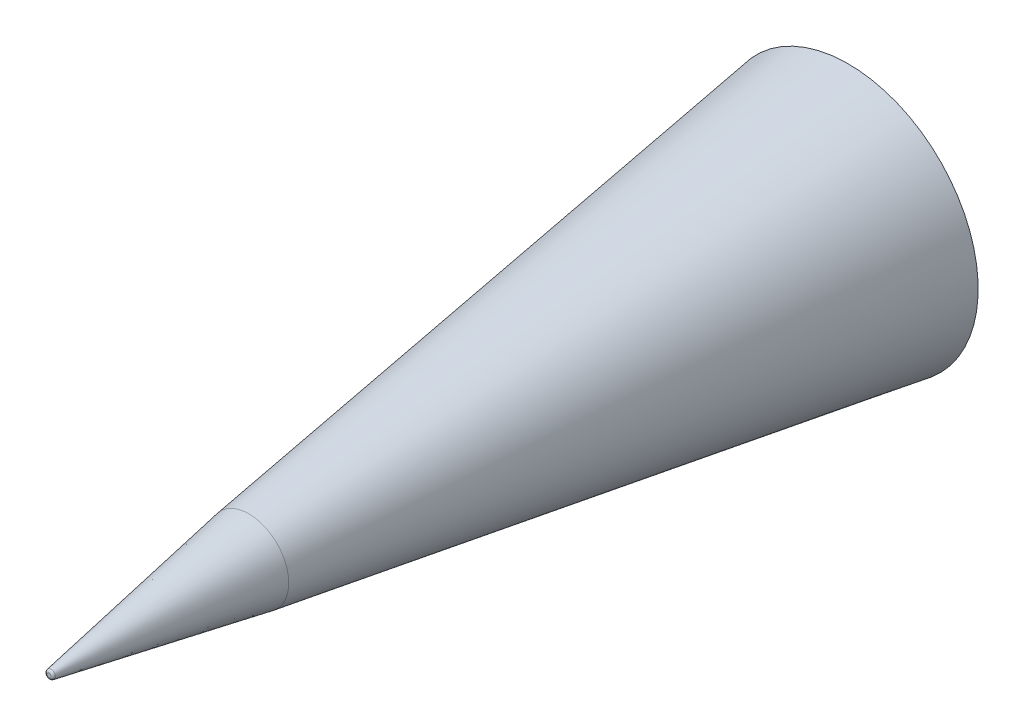
ISO-10303-21;
HEADER;
FILE_DESCRIPTION(('STEP AP214'),'2;1');
FILE_NAME('part.step','',(''),(''),'','','');
FILE_SCHEMA(('AUTOMOTIVE_DESIGN { 1 0 10303 214 1 1 1 1 }'));
ENDSEC;
DATA;
#1=APPLICATION_CONTEXT('core data for automotive mechanical design processes');
#2=APPLICATION_PROTOCOL_DEFINITION('international standard','automotive_design',2000,#1);
#3=PRODUCT_CONTEXT('',#1,'mechanical');
#4=PRODUCT('Part','Part','',(#3));
#5=PRODUCT_RELATED_PRODUCT_CATEGORY('part','',(#4));
#6=PRODUCT_DEFINITION_FORMATION('','',#4);
#7=PRODUCT_DEFINITION_CONTEXT('part definition',#1,'design');
#8=PRODUCT_DEFINITION('design','',#6,#7);
#9=PRODUCT_DEFINITION_SHAPE('','',#8);
#10=(LENGTH_UNIT() NAMED_UNIT(*) SI_UNIT(.MILLI.,.METRE.));
#11=(NAMED_UNIT(*) PLANE_ANGLE_UNIT() SI_UNIT($,.RADIAN.));
#12=(NAMED_UNIT(*) SI_UNIT($,.STERADIAN.) SOLID_ANGLE_UNIT());
#13=UNCERTAINTY_MEASURE_WITH_UNIT(LENGTH_MEASURE(1.E-05),#10,'distance_accuracy_value','');
#14=(GEOMETRIC_REPRESENTATION_CONTEXT(3) GLOBAL_UNCERTAINTY_ASSIGNED_CONTEXT((#13)) GLOBAL_UNIT_ASSIGNED_CONTEXT((#10,
#11,#12)) REPRESENTATION_CONTEXT('',''));
#15=CARTESIAN_POINT('',(0.,0.,0.));
#16=DIRECTION('',(0.,0.,1.));
#17=DIRECTION('',(1.,0.,0.));
#18=AXIS2_PLACEMENT_3D('',#15,#16,#17);
#19=CARTESIAN_POINT('',(0.,3.25,-20.));
#20=DIRECTION('',(0.,0.,1.));
#21=DIRECTION('',(1.,0.,0.));
#22=AXIS2_PLACEMENT_3D('',#19,#20,#21);
#23=PLANE('',#22);
#24=CARTESIAN_POINT('',(0.,0.,-20.));
#25=DIRECTION('',(0.,0.,1.));
#26=DIRECTION('',(1.,0.,0.));
#27=AXIS2_PLACEMENT_3D('',#24,#25,#26);
#28=CIRCLE('',#27,3.25);
#29=CARTESIAN_POINT('',(-3.25,0.,-20.));
#30=VERTEX_POINT('',#29);
#31=EDGE_CURVE('E44',#30,#30,#28,.T.);
#32=ORIENTED_EDGE('',*,*,#31,.F.);
#33=EDGE_LOOP('',(#32));
#34=FACE_BOUND('',#33,.T.);
#35=ADVANCED_FACE('F33',(#34),#23,.F.);
#36=CARTESIAN_POINT('',(0.,0.,-20.));
#37=DIRECTION('',(0.,0.,-1.));
#38=DIRECTION('',(-1.,0.,0.));
#39=AXIS2_PLACEMENT_3D('',#36,#37,#38);
#40=CONICAL_SURFACE('',#39,3.25,0.148889947609497);
#41=CARTESIAN_POINT('',(0.,0.,-5.));
#42=DIRECTION('',(0.,0.,1.));
#43=DIRECTION('',(1.,0.,0.));
#44=AXIS2_PLACEMENT_3D('',#41,#42,#43);
#45=CIRCLE('',#44,0.999999999999998);
#46=CARTESIAN_POINT('',(-0.999999999999998,0.,-5.));
#47=VERTEX_POINT('',#46);
#48=EDGE_CURVE('E48',#47,#47,#45,.T.);
#49=CARTESIAN_POINT('',(-0.999999999999998,0.,-5.));
#50=CARTESIAN_POINT('',(-1.0234375,0.,-5.15625));
#51=CARTESIAN_POINT('',(-1.046875,0.,-5.3125));
#52=CARTESIAN_POINT('',(-1.09375,0.,-5.62500000000001));
#53=CARTESIAN_POINT('',(-1.1171875,0.,-5.78125000000001));
#54=CARTESIAN_POINT('',(-1.1640625,0.,-6.09375));
#55=CARTESIAN_POINT('',(-1.1875,0.,-6.25));
#56=CARTESIAN_POINT('',(-1.234375,0.,-6.5625));
#57=CARTESIAN_POINT('',(-1.2578125,0.,-6.71875));
#58=CARTESIAN_POINT('',(-1.3046875,0.,-7.03125));
#59=CARTESIAN_POINT('',(-1.328125,0.,-7.1875));
#60=CARTESIAN_POINT('',(-1.375,0.,-7.50000000000001));
#61=CARTESIAN_POINT('',(-1.3984375,0.,-7.65625000000001));
#62=CARTESIAN_POINT('',(-1.4453125,0.,-7.96875000000001));
#63=CARTESIAN_POINT('',(-1.46875,0.,-8.125));
#64=CARTESIAN_POINT('',(-1.515625,0.,-8.4375));
#65=CARTESIAN_POINT('',(-1.5390625,0.,-8.59375));
#66=CARTESIAN_POINT('',(-1.5859375,0.,-8.90625));
#67=CARTESIAN_POINT('',(-1.609375,0.,-9.06250000000001));
#68=CARTESIAN_POINT('',(-1.65625,0.,-9.37500000000001));
#69=CARTESIAN_POINT('',(-1.6796875,0.,-9.53125000000001));
#70=CARTESIAN_POINT('',(-1.7265625,0.,-9.84375000000001));
#71=CARTESIAN_POINT('',(-1.75,0.,-10.));
#72=CARTESIAN_POINT('',(-1.796875,0.,-10.3125));
#73=CARTESIAN_POINT('',(-1.8203125,0.,-10.46875));
#74=CARTESIAN_POINT('',(-1.8671875,0.,-10.78125));
#75=CARTESIAN_POINT('',(-1.890625,0.,-10.9375));
#76=CARTESIAN_POINT('',(-1.9375,0.,-11.25));
#77=CARTESIAN_POINT('',(-1.9609375,0.,-11.40625));
#78=CARTESIAN_POINT('',(-2.0078125,0.,-11.71875));
#79=CARTESIAN_POINT('',(-2.03125,0.,-11.875));
#80=CARTESIAN_POINT('',(-2.078125,0.,-12.1875));
#81=CARTESIAN_POINT('',(-2.1015625,0.,-12.34375));
#82=CARTESIAN_POINT('',(-2.1484375,0.,-12.65625));
#83=CARTESIAN_POINT('',(-2.171875,0.,-12.8125));
#84=CARTESIAN_POINT('',(-2.21875,0.,-13.125));
#85=CARTESIAN_POINT('',(-2.2421875,0.,-13.28125));
#86=CARTESIAN_POINT('',(-2.2890625,0.,-13.59375));
#87=CARTESIAN_POINT('',(-2.3125,0.,-13.75));
#88=CARTESIAN_POINT('',(-2.359375,0.,-14.0625));
#89=CARTESIAN_POINT('',(-2.3828125,0.,-14.21875));
#90=CARTESIAN_POINT('',(-2.4296875,0.,-14.53125));
#91=CARTESIAN_POINT('',(-2.453125,0.,-14.6875));
#92=CARTESIAN_POINT('',(-2.5,0.,-15.));
#93=CARTESIAN_POINT('',(-2.5234375,0.,-15.15625));
#94=CARTESIAN_POINT('',(-2.5703125,0.,-15.46875));
#95=CARTESIAN_POINT('',(-2.59375,0.,-15.625));
#96=CARTESIAN_POINT('',(-2.640625,0.,-15.9375));
#97=CARTESIAN_POINT('',(-2.6640625,0.,-16.09375));
#98=CARTESIAN_POINT('',(-2.7109375,0.,-16.40625));
#99=CARTESIAN_POINT('',(-2.734375,0.,-16.5625));
#100=CARTESIAN_POINT('',(-2.78125,0.,-16.875));
#101=CARTESIAN_POINT('',(-2.8046875,0.,-17.03125));
#102=CARTESIAN_POINT('',(-2.8515625,0.,-17.34375));
#103=CARTESIAN_POINT('',(-2.875,0.,-17.5));
#104=CARTESIAN_POINT('',(-2.921875,0.,-17.8125));
#105=CARTESIAN_POINT('',(-2.9453125,0.,-17.96875));
#106=CARTESIAN_POINT('',(-2.9921875,0.,-18.28125));
#107=CARTESIAN_POINT('',(-3.015625,0.,-18.4375));
#108=CARTESIAN_POINT('',(-3.0625,0.,-18.75));
#109=CARTESIAN_POINT('',(-3.0859375,0.,-18.90625));
#110=CARTESIAN_POINT('',(-3.1328125,0.,-19.21875));
#111=CARTESIAN_POINT('',(-3.15625,0.,-19.375));
#112=CARTESIAN_POINT('',(-3.203125,0.,-19.6875));
#113=CARTESIAN_POINT('',(-3.2265625,0.,-19.84375));
#114=CARTESIAN_POINT('',(-3.25,0.,-20.));
#115=B_SPLINE_CURVE_WITH_KNOTS('',3,(#49,#50,#51,#52,#53,#54,#55,#56,#57,#58,#59,#60,#61,#62,
#63,#64,#65,#66,#67,#68,#69,#70,#71,#72,#73,#74,#75,#76,#77,#78,#79,#80,#81,#82,#83,#84,#85,#86,
#87,#88,#89,#90,#91,#92,#93,#94,#95,#96,#97,#98,#99,#100,#101,#102,#103,#104,#105,#106,#107,
#108,#109,#110,#111,#112,#113,#114),.UNSPECIFIED.,.F.,.F.,(4,2,2,2,2,2,2,2,2,2,2,2,2,2,2,2,2,2,
2,2,2,2,2,2,2,2,2,2,2,2,2,2,4),(0.,0.473994103503673,0.947988207007346,1.42198231051102,
1.89597641401469,2.36997051751836,2.84396462102203,3.31795872452571,3.79195282802938,
4.26594693153305,4.73994103503672,5.2139351385404,5.68792924204407,6.16192334554774,
6.63591744905141,7.10991155255508,7.58390565605876,8.05789975956243,8.5318938630661,
9.00588796656978,9.47988207007345,9.95387617357712,10.4278702770808,10.9018643805845,
11.3758584840881,11.8498525875918,12.3238466910955,12.7978407945992,13.2718348981028,
13.7458290016065,14.2198231051102,14.6938172086138,15.1678113121175),.UNSPECIFIED.);
#116=EDGE_CURVE('BSEAM56',#47,#30,#115,.T.);
#117=ORIENTED_EDGE('',*,*,#48,.F.);
#118=ORIENTED_EDGE('',*,*,#31,.T.);
#119=ORIENTED_EDGE('',*,*,#116,.T.);
#120=ORIENTED_EDGE('',*,*,#116,.F.);
#121=EDGE_LOOP('',(#117,#119,#118,#120));
#122=FACE_BOUND('',#121,.T.);
#123=ADVANCED_FACE('F56',(#122),#40,.T.);
#124=CARTESIAN_POINT('',(0.,0.,-5.));
#125=DIRECTION('',(0.,0.,-1.));
#126=DIRECTION('',(-1.,0.,0.));
#127=AXIS2_PLACEMENT_3D('',#124,#125,#126);
#128=CONICAL_SURFACE('',#127,0.999999999999998,0.178092938231197);
#129=CARTESIAN_POINT('',(0.,0.,-0.0493708201010842));
#130=DIRECTION('',(0.,0.,1.));
#131=DIRECTION('',(1.,0.,0.));
#132=AXIS2_PLACEMENT_3D('',#129,#130,#131);
#133=CIRCLE('',#132,0.108886747618195);
#134=CARTESIAN_POINT('',(-0.108886747618195,0.,-0.0493708201010842));
#135=VERTEX_POINT('',#134);
#136=EDGE_CURVE('E10',#135,#135,#133,.F.);
#137=CARTESIAN_POINT('',(-0.108886747618195,0.,-0.0493708201010842));
#138=CARTESIAN_POINT('',(-0.118169177330506,0.,-0.100939874058365));
#139=CARTESIAN_POINT('',(-0.127451607042816,0.,-0.152508928015645));
#140=CARTESIAN_POINT('',(-0.146016466467437,0.,-0.255647035930206));
#141=CARTESIAN_POINT('',(-0.155298896179747,0.,-0.307216089887487));
#142=CARTESIAN_POINT('',(-0.173863755604368,0.,-0.410354197802048));
#143=CARTESIAN_POINT('',(-0.183146185316679,0.,-0.461923251759328));
#144=CARTESIAN_POINT('',(-0.2017110447413,0.,-0.565061359673889));
#145=CARTESIAN_POINT('',(-0.21099347445361,0.,-0.616630413631169));
#146=CARTESIAN_POINT('',(-0.229558333878231,0.,-0.71976852154573));
#147=CARTESIAN_POINT('',(-0.238840763590541,0.,-0.77133757550301));
#148=CARTESIAN_POINT('',(-0.257405623015162,0.,-0.874475683417571));
#149=CARTESIAN_POINT('',(-0.266688052727473,0.,-0.926044737374852));
#150=CARTESIAN_POINT('',(-0.285252912152094,0.,-1.02918284528941));
#151=CARTESIAN_POINT('',(-0.294535341864404,0.,-1.08075189924669));
#152=CARTESIAN_POINT('',(-0.313100201289025,0.,-1.18389000716125));
#153=CARTESIAN_POINT('',(-0.322382631001335,0.,-1.23545906111853));
#154=CARTESIAN_POINT('',(-0.340947490425956,0.,-1.33859716903309));
#155=CARTESIAN_POINT('',(-0.350229920138267,0.,-1.39016622299038));
#156=CARTESIAN_POINT('',(-0.368794779562888,0.,-1.49330433090494));
#157=CARTESIAN_POINT('',(-0.378077209275198,0.,-1.54487338486222));
#158=CARTESIAN_POINT('',(-0.396642068699819,0.,-1.64801149277678));
#159=CARTESIAN_POINT('',(-0.40592449841213,0.,-1.69958054673406));
#160=CARTESIAN_POINT('',(-0.42448935783675,0.,-1.80271865464862));
#161=CARTESIAN_POINT('',(-0.433771787549061,0.,-1.8542877086059));
#162=CARTESIAN_POINT('',(-0.452336646973682,0.,-1.95742581652046));
#163=CARTESIAN_POINT('',(-0.461619076685992,0.,-2.00899487047774));
#164=CARTESIAN_POINT('',(-0.480183936110613,0.,-2.1121329783923));
#165=CARTESIAN_POINT('',(-0.489466365822924,0.,-2.16370203234958));
#166=CARTESIAN_POINT('',(-0.508031225247544,0.,-2.26684014026414));
#167=CARTESIAN_POINT('',(-0.517313654959855,0.,-2.31840919422142));
#168=CARTESIAN_POINT('',(-0.535878514384476,0.,-2.42154730213598));
#169=CARTESIAN_POINT('',(-0.545160944096786,0.,-2.47311635609326));
#170=CARTESIAN_POINT('',(-0.563725803521407,0.,-2.57625446400783));
#171=CARTESIAN_POINT('',(-0.573008233233718,0.,-2.62782351796511));
#172=CARTESIAN_POINT('',(-0.591573092658338,0.,-2.73096162587967));
#173=CARTESIAN_POINT('',(-0.600855522370649,0.,-2.78253067983695));
#174=CARTESIAN_POINT('',(-0.61942038179527,0.,-2.88566878775151));
#175=CARTESIAN_POINT('',(-0.62870281150758,0.,-2.93723784170879));
#176=CARTESIAN_POINT('',(-0.647267670932201,0.,-3.04037594962335));
#177=CARTESIAN_POINT('',(-0.656550100644512,0.,-3.09194500358063));
#178=CARTESIAN_POINT('',(-0.675114960069133,0.,-3.19508311149519));
#179=CARTESIAN_POINT('',(-0.684397389781443,0.,-3.24665216545247));
#180=CARTESIAN_POINT('',(-0.702962249206064,0.,-3.34979027336703));
#181=CARTESIAN_POINT('',(-0.712244678918374,0.,-3.40135932732431));
#182=CARTESIAN_POINT('',(-0.730809538342995,0.,-3.50449743523887));
#183=CARTESIAN_POINT('',(-0.740091968055306,0.,-3.55606648919615));
#184=CARTESIAN_POINT('',(-0.758656827479926,0.,-3.65920459711071));
#185=CARTESIAN_POINT('',(-0.767939257192237,0.,-3.71077365106799));
#186=CARTESIAN_POINT('',(-0.786504116616858,0.,-3.81391175898256));
#187=CARTESIAN_POINT('',(-0.795786546329168,0.,-3.86548081293984));
#188=CARTESIAN_POINT('',(-0.814351405753789,0.,-3.9686189208544));
#189=CARTESIAN_POINT('',(-0.8236338354661,0.,-4.02018797481168));
#190=CARTESIAN_POINT('',(-0.842198694890721,0.,-4.12332608272624));
#191=CARTESIAN_POINT('',(-0.851481124603031,0.,-4.17489513668352));
#192=CARTESIAN_POINT('',(-0.870045984027652,0.,-4.27803324459808));
#193=CARTESIAN_POINT('',(-0.879328413739962,0.,-4.32960229855536));
#194=CARTESIAN_POINT('',(-0.897893273164583,0.,-4.43274040646992));
#195=CARTESIAN_POINT('',(-0.907175702876894,0.,-4.4843094604272));
#196=CARTESIAN_POINT('',(-0.925740562301515,0.,-4.58744756834176));
#197=CARTESIAN_POINT('',(-0.935022992013825,0.,-4.63901662229904));
#198=CARTESIAN_POINT('',(-0.953587851438446,0.,-4.7421547302136));
#199=CARTESIAN_POINT('',(-0.962870281150756,0.,-4.79372378417088));
#200=CARTESIAN_POINT('',(-0.981435140575377,0.,-4.89686189208544));
#201=CARTESIAN_POINT('',(-0.990717570287688,0.,-4.94843094604273));
#202=CARTESIAN_POINT('',(-0.999999999999998,0.,-5.00000000000001));
#203=B_SPLINE_CURVE_WITH_KNOTS('',3,(#137,#138,#139,#140,#141,#142,#143,#144,#145,#146,#147,
#148,#149,#150,#151,#152,#153,#154,#155,#156,#157,#158,#159,#160,#161,#162,#163,#164,#165,#166,
#167,#168,#169,#170,#171,#172,#173,#174,#175,#176,#177,#178,#179,#180,#181,#182,#183,#184,#185,
#186,#187,#188,#189,#190,#191,#192,#193,#194,#195,#196,#197,#198,#199,#200,#201,#202),
.UNSPECIFIED.,.F.,.F.,(4,2,2,2,2,2,2,2,2,2,2,2,2,2,2,2,2,2,2,2,2,2,2,2,2,2,2,2,2,2,2,2,4),(0.,
0.157193439579125,0.31438687915825,0.471580318737374,0.628773758316499,0.785967197895624,
0.943160637474749,1.10035407705387,1.257547516633,1.41474095621212,1.57193439579125,
1.72912783537037,1.8863212749495,2.04351471452862,2.20070815410775,2.35790159368687,
2.515095033266,2.67228847284512,2.82948191242425,2.98667535200337,3.1438687915825,
3.30106223116162,3.45825567074075,3.61544911031987,3.772642549899,3.92983598947812,
4.08702942905724,4.24422286863637,4.4014163082155,4.55860974779462,4.71580318737374,
4.87299662695287,5.03019006653199),.UNSPECIFIED.);
#204=EDGE_CURVE('BSEAM54',#135,#47,#203,.T.);
#205=ORIENTED_EDGE('',*,*,#136,.T.);
#206=ORIENTED_EDGE('',*,*,#48,.T.);
#207=ORIENTED_EDGE('',*,*,#204,.T.);
#208=ORIENTED_EDGE('',*,*,#204,.F.);
#209=EDGE_LOOP('',(#205,#207,#206,#208));
#210=FACE_BOUND('',#209,.T.);
#211=ADVANCED_FACE('F54',(#210),#128,.T.);
#212=CARTESIAN_POINT('',(0.,0.1,0.));
#213=DIRECTION('',(0.,0.,-1.));
#214=DIRECTION('',(-1.,0.,0.));
#215=AXIS2_PLACEMENT_3D('',#212,#213,#214);
#216=PLANE('',#215);
#217=CARTESIAN_POINT('',(0.,0.,0.));
#218=DIRECTION('',(0.,0.,-1.));
#219=DIRECTION('',(-1.,0.,0.));
#220=AXIS2_PLACEMENT_3D('',#217,#218,#219);
#221=CIRCLE('',#220,0.0498357481797734);
#222=CARTESIAN_POINT('',(-0.0498357481797734,0.,0.));
#223=VERTEX_POINT('',#222);
#224=EDGE_CURVE('E40',#223,#223,#221,.F.);
#225=ORIENTED_EDGE('',*,*,#224,.T.);
#226=EDGE_LOOP('',(#225));
#227=FACE_BOUND('',#226,.T.);
#228=ADVANCED_FACE('F68',(#227),#216,.F.);
#229=CARTESIAN_POINT('',(0.,0.,-0.0600000000000002));
#230=DIRECTION('',(0.,0.,-1.));
#231=DIRECTION('',(-1.,0.,0.));
#232=AXIS2_PLACEMENT_3D('',#229,#230,#231);
#233=DEGENERATE_TOROIDAL_SURFACE('',#232,0.0498357481797734,0.06,.T.);
#234=ORIENTED_EDGE('',*,*,#136,.F.);
#235=EDGE_LOOP('',(#234));
#236=FACE_BOUND('',#235,.T.);
#237=ORIENTED_EDGE('',*,*,#224,.F.);
#238=EDGE_LOOP('',(#237));
#239=FACE_BOUND('',#238,.T.);
#240=ADVANCED_FACE('F35',(#236,#239),#233,.T.);
#241=CLOSED_SHELL('',(#35,#123,#211,#228,#240));
#242=MANIFOLD_SOLID_BREP('B2',#241);
#243=ADVANCED_BREP_SHAPE_REPRESENTATION('',(#18,#242),#14);
#244=SHAPE_DEFINITION_REPRESENTATION(#9,#243);
ENDSEC;
END-ISO-10303-21;
